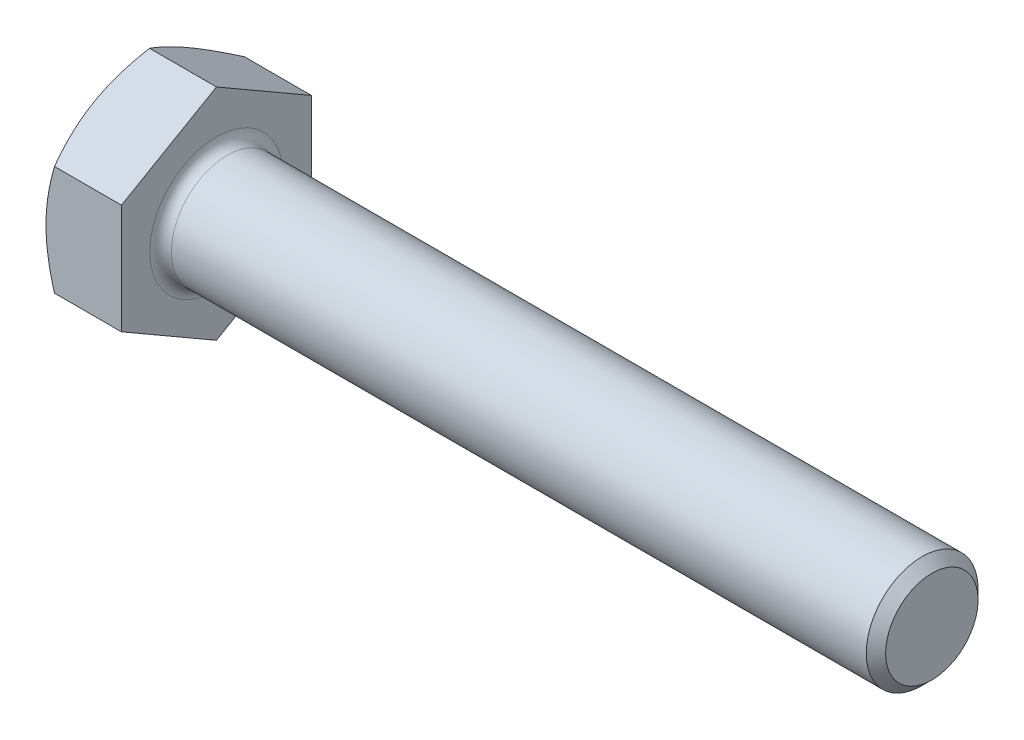
ISO-10303-21;
HEADER;
FILE_DESCRIPTION(('STEP AP214'),'2;1');
FILE_NAME('part.step','',(''),(''),'','','');
FILE_SCHEMA(('AUTOMOTIVE_DESIGN { 1 0 10303 214 1 1 1 1 }'));
ENDSEC;
DATA;
#1=APPLICATION_CONTEXT('core data for automotive mechanical design processes');
#2=APPLICATION_PROTOCOL_DEFINITION('international standard','automotive_design',2000,#1);
#3=PRODUCT_CONTEXT('',#1,'mechanical');
#4=PRODUCT('Part','Part','',(#3));
#5=PRODUCT_RELATED_PRODUCT_CATEGORY('part','',(#4));
#6=PRODUCT_DEFINITION_FORMATION('','',#4);
#7=PRODUCT_DEFINITION_CONTEXT('part definition',#1,'design');
#8=PRODUCT_DEFINITION('design','',#6,#7);
#9=PRODUCT_DEFINITION_SHAPE('','',#8);
#10=(LENGTH_UNIT() NAMED_UNIT(*) SI_UNIT(.MILLI.,.METRE.));
#11=(NAMED_UNIT(*) PLANE_ANGLE_UNIT() SI_UNIT($,.RADIAN.));
#12=(NAMED_UNIT(*) SI_UNIT($,.STERADIAN.) SOLID_ANGLE_UNIT());
#13=UNCERTAINTY_MEASURE_WITH_UNIT(LENGTH_MEASURE(1.E-05),#10,'distance_accuracy_value','');
#14=(GEOMETRIC_REPRESENTATION_CONTEXT(3) GLOBAL_UNCERTAINTY_ASSIGNED_CONTEXT((#13)) GLOBAL_UNIT_ASSIGNED_CONTEXT((#10,
#11,#12)) REPRESENTATION_CONTEXT('',''));
#15=CARTESIAN_POINT('',(0.,0.,0.));
#16=DIRECTION('',(0.,0.,1.));
#17=DIRECTION('',(1.,0.,0.));
#18=AXIS2_PLACEMENT_3D('',#15,#16,#17);
#19=CARTESIAN_POINT('',(-58.0005303203912,-2.0366752609924E-05,3.15651972024237E-06));
#20=DIRECTION('',(1.,0.,0.));
#21=DIRECTION('',(0.,1.,0.));
#22=AXIS2_PLACEMENT_3D('',#19,#20,#21);
#23=PLANE('',#22);
#24=CARTESIAN_POINT('',(-58.000530320382,-2.0366752595966E-05,3.1565197169117E-06));
#25=DIRECTION('',(1.,0.,0.));
#26=DIRECTION('',(0.,1.,0.));
#27=AXIS2_PLACEMENT_3D('',#24,#25,#26);
#28=CIRCLE('',#27,26.9874999999947);
#29=CARTESIAN_POINT('',(-58.0005303203805,-23.3718809513828,-13.4937468434789));
#30=VERTEX_POINT('',#29);
#31=CARTESIAN_POINT('',(-58.0005303203805,-2.03667525978211E-05,-26.9874968434776));
#32=VERTEX_POINT('',#31);
#33=EDGE_CURVE('E496',#30,#32,#28,.T.);
#34=ORIENTED_EDGE('',*,*,#33,.F.);
#35=CARTESIAN_POINT('',(-58.000530320382,-2.03667525958311E-05,3.15651971704658E-06));
#36=DIRECTION('',(1.,0.,0.));
#37=DIRECTION('',(0.,1.,0.));
#38=AXIS2_PLACEMENT_3D('',#35,#36,#37);
#39=CIRCLE('',#38,26.9874999999947);
#40=CARTESIAN_POINT('',(-58.0005303203805,-23.3718809513828,13.4937531565184));
#41=VERTEX_POINT('',#40);
#42=EDGE_CURVE('E107',#41,#30,#39,.T.);
#43=ORIENTED_EDGE('',*,*,#42,.F.);
#44=CARTESIAN_POINT('',(-58.000530320382,-2.03667525961008E-05,3.1565197169117E-06));
#45=DIRECTION('',(1.,0.,0.));
#46=DIRECTION('',(0.,1.,0.));
#47=AXIS2_PLACEMENT_3D('',#44,#45,#46);
#48=CIRCLE('',#47,26.9874999999947);
#49=CARTESIAN_POINT('',(-58.0005303203805,-2.03667526123641E-05,26.9875031565171));
#50=VERTEX_POINT('',#49);
#51=EDGE_CURVE('E104',#50,#41,#48,.T.);
#52=ORIENTED_EDGE('',*,*,#51,.F.);
#53=CARTESIAN_POINT('',(-58.000530320382,-2.03667525958311E-05,3.15651971704658E-06));
#54=DIRECTION('',(1.,0.,0.));
#55=DIRECTION('',(0.,1.,0.));
#56=AXIS2_PLACEMENT_3D('',#53,#54,#55);
#57=CIRCLE('',#56,26.9874999999947);
#58=CARTESIAN_POINT('',(-58.0005303203805,23.3718402178776,13.4937531565184));
#59=VERTEX_POINT('',#58);
#60=EDGE_CURVE('E37',#59,#50,#57,.T.);
#61=ORIENTED_EDGE('',*,*,#60,.F.);
#62=CARTESIAN_POINT('',(-58.000530320382,-2.03667525958311E-05,3.15651971704658E-06));
#63=DIRECTION('',(1.,0.,0.));
#64=DIRECTION('',(0.,1.,0.));
#65=AXIS2_PLACEMENT_3D('',#62,#63,#64);
#66=CIRCLE('',#65,26.9874999999947);
#67=CARTESIAN_POINT('',(-58.0005303203805,23.3718402178776,-13.493746843479));
#68=VERTEX_POINT('',#67);
#69=EDGE_CURVE('E490',#68,#59,#66,.T.);
#70=ORIENTED_EDGE('',*,*,#69,.F.);
#71=CARTESIAN_POINT('',(-58.000530320382,-2.0366752595966E-05,3.1565197169117E-06));
#72=DIRECTION('',(1.,0.,0.));
#73=DIRECTION('',(0.,1.,0.));
#74=AXIS2_PLACEMENT_3D('',#71,#72,#73);
#75=CIRCLE('',#74,26.9874999999947);
#76=EDGE_CURVE('E164',#32,#68,#75,.T.);
#77=ORIENTED_EDGE('',*,*,#76,.F.);
#78=EDGE_LOOP('',(#34,#43,#52,#61,#70,#77));
#79=FACE_BOUND('',#78,.T.);
#80=ADVANCED_FACE('F34',(#79),#23,.F.);
#81=CARTESIAN_POINT('',(-55.5756414858232,-2.0366752597045E-05,3.1565197169117E-06));
#82=DIRECTION('',(1.,0.,0.));
#83=DIRECTION('',(0.,1.,0.));
#84=AXIS2_PLACEMENT_3D('',#81,#82,#83);
#85=CONICAL_SURFACE('',#84,31.18753066419,1.0471975512);
#86=CARTESIAN_POINT('',(-58.000530320379,23.3718402178799,13.4937531565197));
#87=CARTESIAN_POINT('',(-58.0005353544012,23.2065060676351,13.78012030497));
#88=CARTESIAN_POINT('',(-57.9970208255,23.0411770613658,14.0664785437932));
#89=CARTESIAN_POINT('',(-57.9829985085223,22.7105956023868,14.639062426785));
#90=CARTESIAN_POINT('',(-57.9724908249409,22.5453431485701,14.9252880728711));
#91=CARTESIAN_POINT('',(-57.9305535718455,22.049874004314,15.7834658043053));
#92=CARTESIAN_POINT('',(-57.8887097564634,21.719863989697,16.3550599166285));
#93=CARTESIAN_POINT('',(-57.778458963356,21.0626340584388,17.4934155498227));
#94=CARTESIAN_POINT('',(-57.7101857121321,20.735408439007,18.0601869482168));
#95=CARTESIAN_POINT('',(-57.548501473975,20.0825115789614,19.1910374819179));
#96=CARTESIAN_POINT('',(-57.45508982538,19.7568403794909,19.7551165459628));
#97=CARTESIAN_POINT('',(-57.2450448504076,19.1077901818838,20.8793044648809));
#98=CARTESIAN_POINT('',(-57.1284396339963,18.7844088950283,21.4394172839317));
#99=CARTESIAN_POINT('',(-56.8739123923822,18.1397397155662,22.5560170568337));
#100=CARTESIAN_POINT('',(-56.7359890681096,17.8184519517777,23.1125037875656));
#101=CARTESIAN_POINT('',(-56.4401322343829,17.1764672246191,24.2244539526875));
#102=CARTESIAN_POINT('',(-56.2820997861566,16.8557817298499,24.7798975228781));
#103=CARTESIAN_POINT('',(-55.9486440256743,16.2167573723269,25.886720177382));
#104=CARTESIAN_POINT('',(-55.7732249250192,15.8984179612521,26.438100211415));
#105=CARTESIAN_POINT('',(-55.5901040434858,15.5812200230015,26.9875031565213));
#106=B_SPLINE_CURVE_WITH_KNOTS('',3,(#86,#87,#88,#89,#90,#91,#92,#93,#94,#95,#96,#97,#98,#99,
#100,#101,#102,#103,#104,#105),.UNSPECIFIED.,.F.,.F.,(4,2,2,2,2,2,2,2,2,4),(0.,
0.991966034236332,1.98391724638906,3.96733081877745,5.940837277035,7.91439568456661,
9.88557661005472,11.8568777015482,13.8382826880148,15.8192088826776),.UNSPECIFIED.);
#107=CARTESIAN_POINT('',(-55.5901040434858,15.5812200230028,26.9875031565205));
#108=VERTEX_POINT('',#107);
#109=EDGE_CURVE('E126',#59,#108,#106,.T.);
#110=ORIENTED_EDGE('',*,*,#109,.F.);
#111=ORIENTED_EDGE('',*,*,#60,.T.);
#112=CARTESIAN_POINT('',(-55.5901040434858,15.5812200230042,26.9875031565197));
#113=CARTESIAN_POINT('',(-55.7732249250192,14.9468241465028,26.9875031565197));
#114=CARTESIAN_POINT('',(-55.9486440256743,14.3101453243533,26.9875031565197));
#115=CARTESIAN_POINT('',(-56.2820997861566,13.0320966093074,26.9875031565197));
#116=CARTESIAN_POINT('',(-56.4401322343829,12.390725619769,26.9875031565197));
#117=CARTESIAN_POINT('',(-56.7359890681096,11.1067561654518,26.9875031565197));
#118=CARTESIAN_POINT('',(-56.8739123923822,10.4641806378748,26.9875031565197));
#119=CARTESIAN_POINT('',(-57.1284396339963,9.17484227895065,26.9875031565197));
#120=CARTESIAN_POINT('',(-57.2450448504076,8.52807970523963,26.9875031565197));
#121=CARTESIAN_POINT('',(-57.45508982538,7.22997931002544,26.9875031565197));
#122=CARTESIAN_POINT('',(-57.548501473975,6.57863691108439,26.9875031565197));
#123=CARTESIAN_POINT('',(-57.7101857121321,5.27284319099328,26.9875031565197));
#124=CARTESIAN_POINT('',(-57.778458963356,4.61839195212956,26.9875031565197));
#125=CARTESIAN_POINT('',(-57.8887097564634,3.30393208961317,26.9875031565197));
#126=CARTESIAN_POINT('',(-57.9305535718455,2.64391206037921,26.9875031565197));
#127=CARTESIAN_POINT('',(-57.9724908249409,1.652973771867,26.9875031565197));
#128=CARTESIAN_POINT('',(-57.9829985085223,1.32246886423351,26.9875031565197));
#129=CARTESIAN_POINT('',(-57.9970208255,0.661305946275521,26.9875031565197));
#130=CARTESIAN_POINT('',(-58.0005353544012,0.330647933737092,26.9875031565197));
#131=CARTESIAN_POINT('',(-58.000530320379,-2.03667526142769E-05,26.9875031565197));
#132=B_SPLINE_CURVE_WITH_KNOTS('',3,(#112,#113,#114,#115,#116,#117,#118,#119,#120,#121,#122,
#123,#124,#125,#126,#127,#128,#129,#130,#131),.UNSPECIFIED.,.F.,.F.,(4,2,2,2,2,2,2,2,2,4),(0.,
1.98092619466272,3.9623311811293,5.93363227262283,7.90481319811093,9.87837160564253,
11.8518780639001,13.8352916362885,14.8272428484412,15.8192088826775),.UNSPECIFIED.);
#133=EDGE_CURVE('E124',#108,#50,#132,.T.);
#134=ORIENTED_EDGE('',*,*,#133,.F.);
#135=EDGE_LOOP('',(#110,#111,#134));
#136=FACE_BOUND('',#135,.T.);
#137=ADVANCED_FACE('F123',(#136),#85,.T.);
#138=CARTESIAN_POINT('',(-55.5756414858232,-2.0366752597045E-05,3.1565197169117E-06));
#139=DIRECTION('',(1.,0.,0.));
#140=DIRECTION('',(0.,1.,0.));
#141=AXIS2_PLACEMENT_3D('',#138,#139,#140);
#142=CONICAL_SURFACE('',#141,31.18753066419,1.0471975512);
#143=CARTESIAN_POINT('',(-58.000530320379,-2.03667526123025E-05,26.9875031565197));
#144=CARTESIAN_POINT('',(-58.0005353544012,-0.33068866724232,26.9875031565197));
#145=CARTESIAN_POINT('',(-57.9970208255,-0.66134667978075,26.9875031565197));
#146=CARTESIAN_POINT('',(-57.9829985085223,-1.32250959773875,26.9875031565197));
#147=CARTESIAN_POINT('',(-57.9724908249409,-1.65301450537223,26.9875031565197));
#148=CARTESIAN_POINT('',(-57.9305535718455,-2.64395279388444,26.9875031565197));
#149=CARTESIAN_POINT('',(-57.8887097564634,-3.3039728231184,26.9875031565197));
#150=CARTESIAN_POINT('',(-57.778458963356,-4.6184326856348,26.9875031565197));
#151=CARTESIAN_POINT('',(-57.7101857121321,-5.27288392449851,26.9875031565197));
#152=CARTESIAN_POINT('',(-57.548501473975,-6.57867764458963,26.9875031565197));
#153=CARTESIAN_POINT('',(-57.45508982538,-7.23002004353068,26.9875031565197));
#154=CARTESIAN_POINT('',(-57.2450448504076,-8.52812043874487,26.9875031565197));
#155=CARTESIAN_POINT('',(-57.1284396339963,-9.1748830124559,26.9875031565197));
#156=CARTESIAN_POINT('',(-56.8739123923822,-10.4642213713801,26.9875031565197));
#157=CARTESIAN_POINT('',(-56.7359890681096,-11.1067968989571,26.9875031565197));
#158=CARTESIAN_POINT('',(-56.4401322343829,-12.3907663532742,26.9875031565197));
#159=CARTESIAN_POINT('',(-56.2820997861566,-13.0321373428127,26.9875031565197));
#160=CARTESIAN_POINT('',(-55.9486440256743,-14.3101860578586,26.9875031565197));
#161=CARTESIAN_POINT('',(-55.7732249250192,-14.9468648800081,26.9875031565197));
#162=CARTESIAN_POINT('',(-55.5901040434858,-15.5812607565094,26.9875031565197));
#163=B_SPLINE_CURVE_WITH_KNOTS('',3,(#143,#144,#145,#146,#147,#148,#149,#150,#151,#152,#153,
#154,#155,#156,#157,#158,#159,#160,#161,#162),.UNSPECIFIED.,.F.,.F.,(4,2,2,2,2,2,2,2,2,4),(0.,
0.991966034236332,1.98391724638906,3.96733081877745,5.94083727703499,7.9143956845666,
9.88557661005471,11.8568777015482,13.8382826880148,15.8192088826775),.UNSPECIFIED.);
#164=CARTESIAN_POINT('',(-55.5901040434858,-15.5812607565081,26.9875031565205));
#165=VERTEX_POINT('',#164);
#166=EDGE_CURVE('E111',#50,#165,#163,.T.);
#167=ORIENTED_EDGE('',*,*,#166,.F.);
#168=ORIENTED_EDGE('',*,*,#51,.T.);
#169=CARTESIAN_POINT('',(-55.5901040434858,-15.5812607565068,26.9875031565212));
#170=CARTESIAN_POINT('',(-55.7732249250192,-15.8984586947574,26.438100211415));
#171=CARTESIAN_POINT('',(-55.9486440256743,-16.2167981058322,25.886720177382));
#172=CARTESIAN_POINT('',(-56.2820997861566,-16.8558224633552,24.7798975228781));
#173=CARTESIAN_POINT('',(-56.4401322343829,-17.1765079581244,24.2244539526875));
#174=CARTESIAN_POINT('',(-56.7359890681096,-17.818492685283,23.1125037875656));
#175=CARTESIAN_POINT('',(-56.8739123923822,-18.1397804490714,22.5560170568337));
#176=CARTESIAN_POINT('',(-57.1284396339963,-18.7844496285335,21.4394172839317));
#177=CARTESIAN_POINT('',(-57.2450448504076,-19.107830915389,20.8793044648809));
#178=CARTESIAN_POINT('',(-57.45508982538,-19.7568811129961,19.7551165459628));
#179=CARTESIAN_POINT('',(-57.548501473975,-20.0825523124667,19.1910374819179));
#180=CARTESIAN_POINT('',(-57.7101857121321,-20.7354491725122,18.0601869482169));
#181=CARTESIAN_POINT('',(-57.778458963356,-21.0626747919441,17.4934155498227));
#182=CARTESIAN_POINT('',(-57.8887097564634,-21.7199047232023,16.3550599166285));
#183=CARTESIAN_POINT('',(-57.9305535718455,-22.0499147378192,15.7834658043053));
#184=CARTESIAN_POINT('',(-57.9724908249408,-22.5453838820754,14.9252880728711));
#185=CARTESIAN_POINT('',(-57.9829985085223,-22.7106363358921,14.6390624267851));
#186=CARTESIAN_POINT('',(-57.9970208255,-23.0412177948711,14.0664785437932));
#187=CARTESIAN_POINT('',(-58.0005353544012,-23.2065468011403,13.78012030497));
#188=CARTESIAN_POINT('',(-58.0005303203789,-23.3718809513852,13.4937531565197));
#189=B_SPLINE_CURVE_WITH_KNOTS('',3,(#169,#170,#171,#172,#173,#174,#175,#176,#177,#178,#179,
#180,#181,#182,#183,#184,#185,#186,#187,#188),.UNSPECIFIED.,.F.,.F.,(4,2,2,2,2,2,2,2,2,4),(0.,
1.98092619466272,3.96233118112929,5.93363227262282,7.90481319811093,9.87837160564253,
11.8518780639001,13.8352916362885,14.8272428484412,15.8192088826775),.UNSPECIFIED.);
#190=EDGE_CURVE('E114',#165,#41,#189,.T.);
#191=ORIENTED_EDGE('',*,*,#190,.F.);
#192=EDGE_LOOP('',(#167,#168,#191));
#193=FACE_BOUND('',#192,.T.);
#194=ADVANCED_FACE('F112',(#193),#142,.T.);
#195=CARTESIAN_POINT('',(-55.5756414858232,-2.0366752597045E-05,3.1565197169117E-06));
#196=DIRECTION('',(1.,0.,0.));
#197=DIRECTION('',(0.,1.,0.));
#198=AXIS2_PLACEMENT_3D('',#195,#196,#197);
#199=CONICAL_SURFACE('',#198,31.18753066419,1.0471975512);
#200=ORIENTED_EDGE('',*,*,#42,.T.);
#201=CARTESIAN_POINT('',(-55.5901040434858,-31.1625011462635,3.15652124540661E-06));
#202=CARTESIAN_POINT('',(-55.7732249250192,-30.8453032080129,-0.549399788584996));
#203=CARTESIAN_POINT('',(-55.9486440256743,-30.5269637969381,-1.10077982261803));
#204=CARTESIAN_POINT('',(-56.2820997861566,-29.8879394394152,-2.20760247712186));
#205=CARTESIAN_POINT('',(-56.4401322343829,-29.5672539446459,-2.76304604731252));
#206=CARTESIAN_POINT('',(-56.7359890681096,-28.9252692174874,-3.87499621243441));
#207=CARTESIAN_POINT('',(-56.8739123923822,-28.6039814536989,-4.43148294316626));
#208=CARTESIAN_POINT('',(-57.1284396339963,-27.9593122742368,-5.54808271606834));
#209=CARTESIAN_POINT('',(-57.2450448504076,-27.6359309873813,-6.10819553511909));
#210=CARTESIAN_POINT('',(-57.45508982538,-26.9868807897742,-7.23238345403719));
#211=CARTESIAN_POINT('',(-57.548501473975,-26.6612095903036,-7.79646251808204));
#212=CARTESIAN_POINT('',(-57.7101857121321,-26.0083127302581,-8.92731305178313));
#213=CARTESIAN_POINT('',(-57.778458963356,-25.6810871108262,-9.4940844501773));
#214=CARTESIAN_POINT('',(-57.8887097564634,-25.023857179568,-10.6324400833715));
#215=CARTESIAN_POINT('',(-57.9305535718455,-24.693847164951,-11.2040341956947));
#216=CARTESIAN_POINT('',(-57.9724908249409,-24.1983780206949,-12.0622119271289));
#217=CARTESIAN_POINT('',(-57.9829985085223,-24.0331255668782,-12.3484375732149));
#218=CARTESIAN_POINT('',(-57.9970208255,-23.7025441078992,-12.9210214562068));
#219=CARTESIAN_POINT('',(-58.0005353544012,-23.53721510163,-13.2073796950299));
#220=CARTESIAN_POINT('',(-58.000530320379,-23.3718809513851,-13.4937468434803));
#221=B_SPLINE_CURVE_WITH_KNOTS('',3,(#201,#202,#203,#204,#205,#206,#207,#208,#209,#210,#211,
#212,#213,#214,#215,#216,#217,#218,#219,#220),.UNSPECIFIED.,.F.,.F.,(4,2,2,2,2,2,2,2,2,4),(0.,
1.98092619466272,3.96233118112929,5.93363227262282,7.90481319811093,9.87837160564253,
11.8518780639001,13.8352916362885,14.8272428484412,15.8192088826775),.UNSPECIFIED.);
#222=CARTESIAN_POINT('',(-55.5901040434858,-31.1625011462635,3.15651971411683E-06));
#223=VERTEX_POINT('',#222);
#224=EDGE_CURVE('E254',#223,#30,#221,.T.);
#225=ORIENTED_EDGE('',*,*,#224,.F.);
#226=CARTESIAN_POINT('',(-58.000530320379,-23.3718809513852,13.4937531565197));
#227=CARTESIAN_POINT('',(-58.0005353544012,-23.53721510163,13.2073860080694));
#228=CARTESIAN_POINT('',(-57.9970208255,-23.7025441078992,12.9210277692463));
#229=CARTESIAN_POINT('',(-57.9829985085223,-24.0331255668782,12.3484438862544));
#230=CARTESIAN_POINT('',(-57.9724908249409,-24.198378020695,12.0622182401684));
#231=CARTESIAN_POINT('',(-57.9305535718455,-24.6938471649511,11.2040405087341));
#232=CARTESIAN_POINT('',(-57.8887097564634,-25.023857179568,10.632446396411));
#233=CARTESIAN_POINT('',(-57.778458963356,-25.6810871108262,9.49409076321676));
#234=CARTESIAN_POINT('',(-57.7101857121321,-26.0083127302581,8.92731936482258));
#235=CARTESIAN_POINT('',(-57.548501473975,-26.6612095903037,7.79646883112149));
#236=CARTESIAN_POINT('',(-57.45508982538,-26.9868807897742,7.23238976707664));
#237=CARTESIAN_POINT('',(-57.2450448504076,-27.6359309873813,6.10820184815853));
#238=CARTESIAN_POINT('',(-57.1284396339963,-27.9593122742368,5.54808902910778));
#239=CARTESIAN_POINT('',(-56.8739123923822,-28.6039814536989,4.4314892562057));
#240=CARTESIAN_POINT('',(-56.7359890681096,-28.9252692174874,3.87500252547385));
#241=CARTESIAN_POINT('',(-56.4401322343829,-29.5672539446459,2.76305236035195));
#242=CARTESIAN_POINT('',(-56.2820997861566,-29.8879394394152,2.20760879016129));
#243=CARTESIAN_POINT('',(-55.9486440256743,-30.5269637969381,1.10078613565746));
#244=CARTESIAN_POINT('',(-55.7732249250192,-30.8453032080129,0.54940610162443));
#245=CARTESIAN_POINT('',(-55.5901040434858,-31.1625011462636,3.15651818600029E-06));
#246=B_SPLINE_CURVE_WITH_KNOTS('',3,(#226,#227,#228,#229,#230,#231,#232,#233,#234,#235,#236,
#237,#238,#239,#240,#241,#242,#243,#244,#245),.UNSPECIFIED.,.F.,.F.,(4,2,2,2,2,2,2,2,2,4),(0.,
0.991966034236328,1.98391724638905,3.96733081877744,5.94083727703499,7.91439568456659,
9.8855766100547,11.8568777015482,13.8382826880148,15.8192088826775),.UNSPECIFIED.);
#247=EDGE_CURVE('E131',#41,#223,#246,.T.);
#248=ORIENTED_EDGE('',*,*,#247,.F.);
#249=EDGE_LOOP('',(#200,#225,#248));
#250=FACE_BOUND('',#249,.T.);
#251=ADVANCED_FACE('F243',(#250),#199,.T.);
#252=CARTESIAN_POINT('',(-55.5756414858232,-2.0366752597045E-05,3.1565197169117E-06));
#253=DIRECTION('',(1.,0.,0.));
#254=DIRECTION('',(0.,1.,0.));
#255=AXIS2_PLACEMENT_3D('',#252,#253,#254);
#256=CONICAL_SURFACE('',#255,31.18753066419,1.0471975512);
#257=ORIENTED_EDGE('',*,*,#33,.T.);
#258=CARTESIAN_POINT('',(-55.5901040434858,-15.5812607565094,-26.9874968434803));
#259=CARTESIAN_POINT('',(-55.7732249250192,-14.946864880008,-26.9874968434803));
#260=CARTESIAN_POINT('',(-55.9486440256743,-14.3101860578585,-26.9874968434803));
#261=CARTESIAN_POINT('',(-56.2820997861566,-13.0321373428126,-26.9874968434803));
#262=CARTESIAN_POINT('',(-56.4401322343829,-12.3907663532742,-26.9874968434803));
#263=CARTESIAN_POINT('',(-56.7359890681096,-11.106796898957,-26.9874968434803));
#264=CARTESIAN_POINT('',(-56.8739123923822,-10.46422137138,-26.9874968434803));
#265=CARTESIAN_POINT('',(-57.1284396339963,-9.17488301245586,-26.9874968434803));
#266=CARTESIAN_POINT('',(-57.2450448504076,-8.52812043874483,-26.9874968434803));
#267=CARTESIAN_POINT('',(-57.45508982538,-7.23002004353065,-26.9874968434803));
#268=CARTESIAN_POINT('',(-57.548501473975,-6.5786776445896,-26.9874968434803));
#269=CARTESIAN_POINT('',(-57.7101857121321,-5.27288392449848,-26.9874968434803));
#270=CARTESIAN_POINT('',(-57.778458963356,-4.61843268563477,-26.9874968434803));
#271=CARTESIAN_POINT('',(-57.8887097564634,-3.30397282311838,-26.9874968434803));
#272=CARTESIAN_POINT('',(-57.9305535718455,-2.64395279388442,-26.9874968434803));
#273=CARTESIAN_POINT('',(-57.9724908249409,-1.65301450537221,-26.9874968434803));
#274=CARTESIAN_POINT('',(-57.9829985085223,-1.32250959773872,-26.9874968434803));
#275=CARTESIAN_POINT('',(-57.9970208255,-0.661346679780728,-26.9874968434803));
#276=CARTESIAN_POINT('',(-58.0005353544012,-0.330688667242299,-26.9874968434803));
#277=CARTESIAN_POINT('',(-58.000530320379,-2.03667525923955E-05,-26.9874968434803));
#278=B_SPLINE_CURVE_WITH_KNOTS('',3,(#258,#259,#260,#261,#262,#263,#264,#265,#266,#267,#268,
#269,#270,#271,#272,#273,#274,#275,#276,#277),.UNSPECIFIED.,.F.,.F.,(4,2,2,2,2,2,2,2,2,4),(0.,
1.98092619466272,3.96233118112929,5.93363227262282,7.90481319811093,9.87837160564253,
11.8518780639001,13.8352916362885,14.8272428484412,15.8192088826775),.UNSPECIFIED.);
#279=CARTESIAN_POINT('',(-55.5901040434858,-15.581260756508,-26.987496843481));
#280=VERTEX_POINT('',#279);
#281=EDGE_CURVE('E226',#280,#32,#278,.T.);
#282=ORIENTED_EDGE('',*,*,#281,.F.);
#283=CARTESIAN_POINT('',(-58.000530320379,-23.3718809513851,-13.4937468434803));
#284=CARTESIAN_POINT('',(-58.0005353544012,-23.2065468011403,-13.7801139919306));
#285=CARTESIAN_POINT('',(-57.9970208255,-23.0412177948711,-14.0664722307537));
#286=CARTESIAN_POINT('',(-57.9829985085223,-22.7106363358921,-14.6390561137456));
#287=CARTESIAN_POINT('',(-57.9724908249409,-22.5453838820753,-14.9252817598316));
#288=CARTESIAN_POINT('',(-57.9305535718455,-22.0499147378192,-15.7834594912659));
#289=CARTESIAN_POINT('',(-57.8887097564634,-21.7199047232022,-16.355053603589));
#290=CARTESIAN_POINT('',(-57.778458963356,-21.062674791944,-17.4934092367832));
#291=CARTESIAN_POINT('',(-57.7101857121322,-20.7354491725122,-18.0601806351774));
#292=CARTESIAN_POINT('',(-57.548501473975,-20.0825523124666,-19.1910311688785));
#293=CARTESIAN_POINT('',(-57.45508982538,-19.7568811129961,-19.7551102329234));
#294=CARTESIAN_POINT('',(-57.2450448504076,-19.107830915389,-20.8792981518415));
#295=CARTESIAN_POINT('',(-57.1284396339963,-18.7844496285335,-21.4394109708922));
#296=CARTESIAN_POINT('',(-56.8739123923822,-18.1397804490714,-22.5560107437943));
#297=CARTESIAN_POINT('',(-56.7359890681096,-17.8184926852829,-23.1124974745262));
#298=CARTESIAN_POINT('',(-56.4401322343829,-17.1765079581243,-24.224447639648));
#299=CARTESIAN_POINT('',(-56.2820997861566,-16.8558224633551,-24.7798912098387));
#300=CARTESIAN_POINT('',(-55.9486440256743,-16.2167981058321,-25.8867138643425));
#301=CARTESIAN_POINT('',(-55.7732249250192,-15.8984586947574,-26.4380938983756));
#302=CARTESIAN_POINT('',(-55.5901040434858,-15.5812607565067,-26.9874968434818));
#303=B_SPLINE_CURVE_WITH_KNOTS('',3,(#283,#284,#285,#286,#287,#288,#289,#290,#291,#292,#293,
#294,#295,#296,#297,#298,#299,#300,#301,#302),.UNSPECIFIED.,.F.,.F.,(4,2,2,2,2,2,2,2,2,4),(0.,
0.99196603423633,1.98391724638906,3.96733081877745,5.940837277035,7.9143956845666,
9.88557661005471,11.8568777015482,13.8382826880148,15.8192088826775),.UNSPECIFIED.);
#304=EDGE_CURVE('E234',#30,#280,#303,.T.);
#305=ORIENTED_EDGE('',*,*,#304,.F.);
#306=EDGE_LOOP('',(#257,#282,#305));
#307=FACE_BOUND('',#306,.T.);
#308=ADVANCED_FACE('F240',(#307),#256,.T.);
#309=CARTESIAN_POINT('',(-55.5756414858232,-2.0366752597045E-05,3.1565197169117E-06));
#310=DIRECTION('',(1.,0.,0.));
#311=DIRECTION('',(0.,1.,0.));
#312=AXIS2_PLACEMENT_3D('',#309,#310,#311);
#313=CONICAL_SURFACE('',#312,31.18753066419,1.0471975512);
#314=CARTESIAN_POINT('',(-58.0005303203789,23.3718402178799,-13.4937468434803));
#315=CARTESIAN_POINT('',(-58.0005353544012,23.5371743681248,-13.20737969503));
#316=CARTESIAN_POINT('',(-57.9970208255,23.702503374394,-12.9210214562068));
#317=CARTESIAN_POINT('',(-57.9829985085223,24.033084833373,-12.348437573215));
#318=CARTESIAN_POINT('',(-57.9724908249408,24.1983372871897,-12.0622119271289));
#319=CARTESIAN_POINT('',(-57.9305535718455,24.6938064314459,-11.2040341956947));
#320=CARTESIAN_POINT('',(-57.8887097564634,25.0238164460628,-10.6324400833715));
#321=CARTESIAN_POINT('',(-57.778458963356,25.681046377321,-9.49408445017732));
#322=CARTESIAN_POINT('',(-57.7101857121321,26.0082719967529,-8.92731305178314));
#323=CARTESIAN_POINT('',(-57.548501473975,26.6611688567984,-7.79646251808205));
#324=CARTESIAN_POINT('',(-57.45508982538,26.986840056269,-7.2323834540372));
#325=CARTESIAN_POINT('',(-57.2450448504076,27.6358902538761,-6.10819553511909));
#326=CARTESIAN_POINT('',(-57.1284396339963,27.9592715407316,-5.54808271606834));
#327=CARTESIAN_POINT('',(-56.8739123923822,28.6039407201937,-4.43148294316626));
#328=CARTESIAN_POINT('',(-56.7359890681096,28.9252284839822,-3.87499621243441));
#329=CARTESIAN_POINT('',(-56.4401322343829,29.5672132111407,-2.76304604731251));
#330=CARTESIAN_POINT('',(-56.2820997861566,29.88789870591,-2.20760247712185));
#331=CARTESIAN_POINT('',(-55.9486440256743,30.5269230634329,-1.10077982261801));
#332=CARTESIAN_POINT('',(-55.7732249250192,30.8452624745077,-0.549399788584981));
#333=CARTESIAN_POINT('',(-55.5901040434857,31.1624604127583,3.15652126326831E-06));
#334=B_SPLINE_CURVE_WITH_KNOTS('',3,(#314,#315,#316,#317,#318,#319,#320,#321,#322,#323,#324,
#325,#326,#327,#328,#329,#330,#331,#332,#333),.UNSPECIFIED.,.F.,.F.,(4,2,2,2,2,2,2,2,2,4),(0.,
0.991966034236332,1.98391724638906,3.96733081877745,5.94083727703499,7.9143956845666,
9.88557661005471,11.8568777015482,13.8382826880148,15.8192088826776),.UNSPECIFIED.);
#335=CARTESIAN_POINT('',(-55.590104043486,31.1624604127579,3.1565189505843E-06));
#336=VERTEX_POINT('',#335);
#337=EDGE_CURVE('E206',#68,#336,#334,.T.);
#338=ORIENTED_EDGE('',*,*,#337,.F.);
#339=ORIENTED_EDGE('',*,*,#69,.T.);
#340=CARTESIAN_POINT('',(-55.5901040434857,31.1624604127583,3.15651817561145E-06));
#341=CARTESIAN_POINT('',(-55.7732249250192,30.8452624745077,0.54940610162442));
#342=CARTESIAN_POINT('',(-55.9486440256743,30.5269230634329,1.10078613565745));
#343=CARTESIAN_POINT('',(-56.2820997861566,29.8878987059099,2.20760879016128));
#344=CARTESIAN_POINT('',(-56.4401322343829,29.5672132111407,2.76305236035194));
#345=CARTESIAN_POINT('',(-56.7359890681096,28.9252284839821,3.87500252547384));
#346=CARTESIAN_POINT('',(-56.8739123923822,28.6039407201936,4.43148925620569));
#347=CARTESIAN_POINT('',(-57.1284396339963,27.9592715407316,5.54808902910777));
#348=CARTESIAN_POINT('',(-57.2450448504076,27.635890253876,6.10820184815852));
#349=CARTESIAN_POINT('',(-57.45508982538,26.9868400562689,7.23238976707662));
#350=CARTESIAN_POINT('',(-57.548501473975,26.6611688567984,7.79646883112147));
#351=CARTESIAN_POINT('',(-57.7101857121321,26.0082719967529,8.92731936482256));
#352=CARTESIAN_POINT('',(-57.778458963356,25.681046377321,9.49409076321674));
#353=CARTESIAN_POINT('',(-57.8887097564634,25.0238164460628,10.6324463964109));
#354=CARTESIAN_POINT('',(-57.9305535718455,24.6938064314458,11.2040405087341));
#355=CARTESIAN_POINT('',(-57.9724908249409,24.1983372871897,12.0622182401683));
#356=CARTESIAN_POINT('',(-57.9829985085223,24.033084833373,12.3484438862544));
#357=CARTESIAN_POINT('',(-57.9970208255,23.702503374394,12.9210277692462));
#358=CARTESIAN_POINT('',(-58.0005353544012,23.5371743681248,13.2073860080694));
#359=CARTESIAN_POINT('',(-58.000530320379,23.3718402178799,13.4937531565197));
#360=B_SPLINE_CURVE_WITH_KNOTS('',3,(#340,#341,#342,#343,#344,#345,#346,#347,#348,#349,#350,
#351,#352,#353,#354,#355,#356,#357,#358,#359),.UNSPECIFIED.,.F.,.F.,(4,2,2,2,2,2,2,2,2,4),(0.,
1.98092619466272,3.9623311811293,5.93363227262283,7.90481319811094,9.87837160564254,
11.8518780639001,13.8352916362885,14.8272428484412,15.8192088826775),.UNSPECIFIED.);
#361=EDGE_CURVE('E119',#336,#59,#360,.T.);
#362=ORIENTED_EDGE('',*,*,#361,.F.);
#363=EDGE_LOOP('',(#338,#339,#362));
#364=FACE_BOUND('',#363,.T.);
#365=ADVANCED_FACE('F180',(#364),#313,.T.);
#366=CARTESIAN_POINT('',(-55.5756414858232,-2.0366752597045E-05,3.1565197169117E-06));
#367=DIRECTION('',(1.,0.,0.));
#368=DIRECTION('',(0.,1.,0.));
#369=AXIS2_PLACEMENT_3D('',#366,#367,#368);
#370=CONICAL_SURFACE('',#369,31.1875306641901,1.0471975512);
#371=ORIENTED_EDGE('',*,*,#76,.T.);
#372=CARTESIAN_POINT('',(-55.5901040434857,15.5812200230015,-26.9874968434818));
#373=CARTESIAN_POINT('',(-55.7732249250192,15.8984179612522,-26.4380938983756));
#374=CARTESIAN_POINT('',(-55.9486440256743,16.216757372327,-25.8867138643425));
#375=CARTESIAN_POINT('',(-56.2820997861566,16.8557817298499,-24.7798912098387));
#376=CARTESIAN_POINT('',(-56.4401322343829,17.1764672246191,-24.2244476396481));
#377=CARTESIAN_POINT('',(-56.7359890681096,17.8184519517777,-23.1124974745262));
#378=CARTESIAN_POINT('',(-56.8739123923822,18.1397397155662,-22.5560107437943));
#379=CARTESIAN_POINT('',(-57.1284396339963,18.7844088950283,-21.4394109708922));
#380=CARTESIAN_POINT('',(-57.2450448504076,19.1077901818838,-20.8792981518415));
#381=CARTESIAN_POINT('',(-57.45508982538,19.7568403794909,-19.7551102329234));
#382=CARTESIAN_POINT('',(-57.548501473975,20.0825115789614,-19.1910311688785));
#383=CARTESIAN_POINT('',(-57.7101857121321,20.735408439007,-18.0601806351774));
#384=CARTESIAN_POINT('',(-57.778458963356,21.0626340584388,-17.4934092367833));
#385=CARTESIAN_POINT('',(-57.8887097564634,21.719863989697,-16.3550536035891));
#386=CARTESIAN_POINT('',(-57.9305535718455,22.049874004314,-15.7834594912659));
#387=CARTESIAN_POINT('',(-57.9724908249408,22.5453431485701,-14.9252817598317));
#388=CARTESIAN_POINT('',(-57.9829985085223,22.7105956023869,-14.6390561137456));
#389=CARTESIAN_POINT('',(-57.9970208255,23.0411770613659,-14.0664722307538));
#390=CARTESIAN_POINT('',(-58.0005353544012,23.2065060676351,-13.7801139919306));
#391=CARTESIAN_POINT('',(-58.0005303203789,23.3718402178799,-13.4937468434803));
#392=B_SPLINE_CURVE_WITH_KNOTS('',3,(#372,#373,#374,#375,#376,#377,#378,#379,#380,#381,#382,
#383,#384,#385,#386,#387,#388,#389,#390,#391),.UNSPECIFIED.,.F.,.F.,(4,2,2,2,2,2,2,2,2,4),(0.,
1.98092619466272,3.96233118112929,5.93363227262283,7.90481319811093,9.87837160564253,
11.8518780639001,13.8352916362885,14.8272428484412,15.8192088826775),.UNSPECIFIED.);
#393=CARTESIAN_POINT('',(-55.5901040434857,15.5812200230029,-26.987496843481));
#394=VERTEX_POINT('',#393);
#395=EDGE_CURVE('E195',#394,#68,#392,.T.);
#396=ORIENTED_EDGE('',*,*,#395,.F.);
#397=CARTESIAN_POINT('',(-58.000530320379,-2.03667525947187E-05,-26.9874968434803));
#398=CARTESIAN_POINT('',(-58.0005353544012,0.330647933737113,-26.9874968434803));
#399=CARTESIAN_POINT('',(-57.9970208255,0.661305946275543,-26.9874968434803));
#400=CARTESIAN_POINT('',(-57.9829985085223,1.32246886423354,-26.9874968434803));
#401=CARTESIAN_POINT('',(-57.9724908249408,1.65297377186702,-26.9874968434803));
#402=CARTESIAN_POINT('',(-57.9305535718455,2.64391206037924,-26.9874968434803));
#403=CARTESIAN_POINT('',(-57.8887097564634,3.3039320896132,-26.9874968434803));
#404=CARTESIAN_POINT('',(-57.778458963356,4.61839195212959,-26.9874968434803));
#405=CARTESIAN_POINT('',(-57.7101857121321,5.27284319099331,-26.9874968434803));
#406=CARTESIAN_POINT('',(-57.548501473975,6.57863691108443,-26.9874968434803));
#407=CARTESIAN_POINT('',(-57.45508982538,7.22997931002547,-26.9874968434803));
#408=CARTESIAN_POINT('',(-57.2450448504076,8.52807970523966,-26.9874968434803));
#409=CARTESIAN_POINT('',(-57.1284396339963,9.17484227895069,-26.9874968434803));
#410=CARTESIAN_POINT('',(-56.8739123923822,10.4641806378749,-26.9874968434803));
#411=CARTESIAN_POINT('',(-56.7359890681096,11.1067561654518,-26.9874968434803));
#412=CARTESIAN_POINT('',(-56.4401322343829,12.390725619769,-26.9874968434803));
#413=CARTESIAN_POINT('',(-56.2820997861566,13.0320966093074,-26.9874968434803));
#414=CARTESIAN_POINT('',(-55.9486440256743,14.3101453243534,-26.9874968434803));
#415=CARTESIAN_POINT('',(-55.7732249250192,14.9468241465029,-26.9874968434803));
#416=CARTESIAN_POINT('',(-55.5901040434857,15.5812200230042,-26.9874968434803));
#417=B_SPLINE_CURVE_WITH_KNOTS('',3,(#397,#398,#399,#400,#401,#402,#403,#404,#405,#406,#407,
#408,#409,#410,#411,#412,#413,#414,#415,#416),.UNSPECIFIED.,.F.,.F.,(4,2,2,2,2,2,2,2,2,4),(0.,
0.991966034236331,1.98391724638906,3.96733081877745,5.94083727703499,7.9143956845666,
9.8855766100547,11.8568777015482,13.8382826880148,15.8192088826775),.UNSPECIFIED.);
#418=EDGE_CURVE('E186',#32,#394,#417,.T.);
#419=ORIENTED_EDGE('',*,*,#418,.F.);
#420=EDGE_LOOP('',(#371,#396,#419));
#421=FACE_BOUND('',#420,.T.);
#422=ADVANCED_FACE('F175',(#421),#370,.T.);
#423=CARTESIAN_POINT('',(-36.5692803203912,31.1624604127574,3.15651973994883E-06));
#424=DIRECTION('',(0.,0.866025403784438,0.500000000000001));
#425=DIRECTION('',(0.,-0.500000000000001,0.866025403784438));
#426=AXIS2_PLACEMENT_3D('',#423,#424,#425);
#427=PLANE('',#426);
#428=DIRECTION('',(1.,0.,0.));
#429=VECTOR('',#428,1.);
#430=CARTESIAN_POINT('',(-36.5692803203912,31.1624604127575,3.1565197238506E-06));
#431=LINE('',#430,#429);
#432=CARTESIAN_POINT('',(-36.5692803203912,31.1624604127574,3.1565197351263E-06));
#433=VERTEX_POINT('',#432);
#434=EDGE_CURVE('E311',#336,#433,#431,.T.);
#435=ORIENTED_EDGE('',*,*,#434,.F.);
#436=ORIENTED_EDGE('',*,*,#361,.T.);
#437=ORIENTED_EDGE('',*,*,#109,.T.);
#438=DIRECTION('',(1.,0.,0.));
#439=VECTOR('',#438,1.);
#440=CARTESIAN_POINT('',(-36.5692803203912,15.5812200230024,26.9875031565197));
#441=LINE('',#440,#439);
#442=CARTESIAN_POINT('',(-36.5692803203912,15.5812200230024,26.9875031565197));
#443=VERTEX_POINT('',#442);
#444=EDGE_CURVE('E118',#443,#108,#441,.F.);
#445=ORIENTED_EDGE('',*,*,#444,.F.);
#446=DIRECTION('',(0.,-0.500000000000001,0.866025403784438));
#447=VECTOR('',#446,1.);
#448=CARTESIAN_POINT('',(-36.5692803203912,31.1624604127574,3.15651973994883E-06));
#449=LINE('',#448,#447);
#450=EDGE_CURVE('E203',#433,#443,#449,.T.);
#451=ORIENTED_EDGE('',*,*,#450,.F.);
#452=EDGE_LOOP('',(#435,#436,#437,#445,#451));
#453=FACE_BOUND('',#452,.T.);
#454=ADVANCED_FACE('F171',(#453),#427,.T.);
#455=CARTESIAN_POINT('',(-36.5692803203912,15.5812200230024,26.9875031565197));
#456=DIRECTION('',(0.,0.,1.));
#457=DIRECTION('',(0.,-1.,0.));
#458=AXIS2_PLACEMENT_3D('',#455,#456,#457);
#459=PLANE('',#458);
#460=ORIENTED_EDGE('',*,*,#444,.T.);
#461=ORIENTED_EDGE('',*,*,#133,.T.);
#462=ORIENTED_EDGE('',*,*,#166,.T.);
#463=DIRECTION('',(1.,0.,0.));
#464=VECTOR('',#463,1.);
#465=CARTESIAN_POINT('',(-36.5692803203912,-15.5812607565076,26.9875031565197));
#466=LINE('',#465,#464);
#467=CARTESIAN_POINT('',(-36.5692803203912,-15.5812607565076,26.9875031565197));
#468=VERTEX_POINT('',#467);
#469=EDGE_CURVE('E260',#468,#165,#466,.F.);
#470=ORIENTED_EDGE('',*,*,#469,.F.);
#471=DIRECTION('',(0.,1.,0.));
#472=VECTOR('',#471,1.);
#473=CARTESIAN_POINT('',(-36.5692803203912,-2.03667526062737E-05,26.9875031565197));
#474=LINE('',#473,#472);
#475=EDGE_CURVE('E289',#443,#468,#474,.F.);
#476=ORIENTED_EDGE('',*,*,#475,.F.);
#477=EDGE_LOOP('',(#460,#461,#462,#470,#476));
#478=FACE_BOUND('',#477,.T.);
#479=ADVANCED_FACE('F128',(#478),#459,.T.);
#480=CARTESIAN_POINT('',(-36.5692803203912,-15.5812607565076,26.9875031565197));
#481=DIRECTION('',(0.,-0.866025403784439,0.5));
#482=DIRECTION('',(0.,-0.5,-0.866025403784439));
#483=AXIS2_PLACEMENT_3D('',#480,#481,#482);
#484=PLANE('',#483);
#485=DIRECTION('',(0.,-0.499999999999999,-0.866025403784439));
#486=VECTOR('',#485,1.);
#487=CARTESIAN_POINT('',(-36.5692803203912,-15.5812607565076,26.9875031565197));
#488=LINE('',#487,#486);
#489=CARTESIAN_POINT('',(-36.5692803203912,-31.1625011462626,3.15651970451258E-06));
#490=VERTEX_POINT('',#489);
#491=EDGE_CURVE('E294',#468,#490,#488,.T.);
#492=ORIENTED_EDGE('',*,*,#491,.F.);
#493=ORIENTED_EDGE('',*,*,#469,.T.);
#494=ORIENTED_EDGE('',*,*,#190,.T.);
#495=ORIENTED_EDGE('',*,*,#247,.T.);
#496=DIRECTION('',(1.,0.,0.));
#497=VECTOR('',#496,1.);
#498=CARTESIAN_POINT('',(-36.5692803203912,-31.1625011462626,3.15651969887058E-06));
#499=LINE('',#498,#497);
#500=EDGE_CURVE('E233',#490,#223,#499,.F.);
#501=ORIENTED_EDGE('',*,*,#500,.F.);
#502=EDGE_LOOP('',(#492,#493,#494,#495,#501));
#503=FACE_BOUND('',#502,.T.);
#504=ADVANCED_FACE('F305',(#503),#484,.T.);
#505=CARTESIAN_POINT('',(-36.5692803203912,-31.1625011462626,3.15651969887058E-06));
#506=DIRECTION('',(0.,-0.866025403784438,-0.500000000000001));
#507=DIRECTION('',(0.,0.500000000000001,-0.866025403784438));
#508=AXIS2_PLACEMENT_3D('',#505,#506,#507);
#509=PLANE('',#508);
#510=DIRECTION('',(0.,0.500000000000001,-0.866025403784438));
#511=VECTOR('',#510,1.);
#512=CARTESIAN_POINT('',(-36.5692803203912,-31.1625011462626,3.15651969887058E-06));
#513=LINE('',#512,#511);
#514=CARTESIAN_POINT('',(-36.5692803203912,-15.5812607565076,-26.9874968434803));
#515=VERTEX_POINT('',#514);
#516=EDGE_CURVE('E284',#490,#515,#513,.T.);
#517=ORIENTED_EDGE('',*,*,#516,.F.);
#518=ORIENTED_EDGE('',*,*,#500,.T.);
#519=ORIENTED_EDGE('',*,*,#224,.T.);
#520=ORIENTED_EDGE('',*,*,#304,.T.);
#521=DIRECTION('',(1.,0.,0.));
#522=VECTOR('',#521,1.);
#523=CARTESIAN_POINT('',(-36.5692803203912,-15.5812607565076,-26.9874968434803));
#524=LINE('',#523,#522);
#525=EDGE_CURVE('E308',#515,#280,#524,.F.);
#526=ORIENTED_EDGE('',*,*,#525,.F.);
#527=EDGE_LOOP('',(#517,#518,#519,#520,#526));
#528=FACE_BOUND('',#527,.T.);
#529=ADVANCED_FACE('F223',(#528),#509,.T.);
#530=CARTESIAN_POINT('',(-36.5692803203912,-15.5812607565076,-26.9874968434803));
#531=DIRECTION('',(0.,0.,-1.));
#532=DIRECTION('',(0.,1.,0.));
#533=AXIS2_PLACEMENT_3D('',#530,#531,#532);
#534=PLANE('',#533);
#535=DIRECTION('',(0.,1.,0.));
#536=VECTOR('',#535,1.);
#537=CARTESIAN_POINT('',(-36.5692803203912,-2.03667526062737E-05,-26.9874968434803));
#538=LINE('',#537,#536);
#539=CARTESIAN_POINT('',(-36.5692803203912,15.5812200230024,-26.9874968434803));
#540=VERTEX_POINT('',#539);
#541=EDGE_CURVE('E279',#515,#540,#538,.T.);
#542=ORIENTED_EDGE('',*,*,#541,.F.);
#543=ORIENTED_EDGE('',*,*,#525,.T.);
#544=ORIENTED_EDGE('',*,*,#281,.T.);
#545=ORIENTED_EDGE('',*,*,#418,.T.);
#546=DIRECTION('',(1.,0.,0.));
#547=VECTOR('',#546,1.);
#548=CARTESIAN_POINT('',(-36.5692803203912,15.5812200230024,-26.9874968434803));
#549=LINE('',#548,#547);
#550=EDGE_CURVE('E52',#540,#394,#549,.F.);
#551=ORIENTED_EDGE('',*,*,#550,.F.);
#552=EDGE_LOOP('',(#542,#543,#544,#545,#551));
#553=FACE_BOUND('',#552,.T.);
#554=ADVANCED_FACE('F216',(#553),#534,.T.);
#555=CARTESIAN_POINT('',(-36.5692803203912,15.5812200230024,-26.9874968434803));
#556=DIRECTION('',(0.,0.866025403784439,-0.5));
#557=DIRECTION('',(0.,0.5,0.866025403784439));
#558=AXIS2_PLACEMENT_3D('',#555,#556,#557);
#559=PLANE('',#558);
#560=ORIENTED_EDGE('',*,*,#550,.T.);
#561=ORIENTED_EDGE('',*,*,#395,.T.);
#562=ORIENTED_EDGE('',*,*,#337,.T.);
#563=ORIENTED_EDGE('',*,*,#434,.T.);
#564=DIRECTION('',(0.,0.499999999999999,0.866025403784439));
#565=VECTOR('',#564,1.);
#566=CARTESIAN_POINT('',(-36.5692803203912,15.5812200230024,-26.9874968434803));
#567=LINE('',#566,#565);
#568=EDGE_CURVE('E276',#540,#433,#567,.T.);
#569=ORIENTED_EDGE('',*,*,#568,.F.);
#570=EDGE_LOOP('',(#560,#561,#562,#563,#569));
#571=FACE_BOUND('',#570,.T.);
#572=ADVANCED_FACE('F211',(#571),#559,.T.);
#573=CARTESIAN_POINT('',(166.630719679609,7.93747963324744,3.1565197169117E-06));
#574=DIRECTION('',(1.,0.,0.));
#575=DIRECTION('',(0.,1.,0.));
#576=AXIS2_PLACEMENT_3D('',#573,#574,#575);
#577=PLANE('',#576);
#578=CARTESIAN_POINT('',(166.630719679605,-2.03667525849019E-05,3.1565197169117E-06));
#579=DIRECTION('',(-1.,0.,0.));
#580=DIRECTION('',(0.,0.,1.));
#581=AXIS2_PLACEMENT_3D('',#578,#579,#580);
#582=CIRCLE('',#581,13.1267199999964);
#583=CARTESIAN_POINT('',(166.630719679605,-2.03667525849019E-05,13.1267231565162));
#584=VERTEX_POINT('',#583);
#585=EDGE_CURVE('E204',#584,#584,#582,.T.);
#586=ORIENTED_EDGE('',*,*,#585,.F.);
#587=EDGE_LOOP('',(#586));
#588=FACE_BOUND('',#587,.T.);
#589=ADVANCED_FACE('F215',(#588),#577,.T.);
#590=CARTESIAN_POINT('',(-36.5692803203912,-2.03667526062737E-05,3.15651971857704E-06));
#591=DIRECTION('',(1.,0.,0.));
#592=DIRECTION('',(0.,1.,0.));
#593=AXIS2_PLACEMENT_3D('',#590,#591,#592);
#594=PLANE('',#593);
#595=CARTESIAN_POINT('',(-36.5692803203912,-2.03667526057186E-05,3.1565197169117E-06));
#596=DIRECTION('',(1.,0.,0.));
#597=DIRECTION('',(0.,1.,0.));
#598=AXIS2_PLACEMENT_3D('',#595,#596,#597);
#599=CIRCLE('',#598,18.923);
#600=CARTESIAN_POINT('',(-36.5692803203912,18.9229796332474,3.15651971155125E-06));
#601=VERTEX_POINT('',#600);
#602=EDGE_CURVE('E349',#601,#601,#599,.F.);
#603=ORIENTED_EDGE('',*,*,#602,.T.);
#604=EDGE_LOOP('',(#603));
#605=FACE_BOUND('',#604,.T.);
#606=ORIENTED_EDGE('',*,*,#541,.T.);
#607=ORIENTED_EDGE('',*,*,#568,.T.);
#608=ORIENTED_EDGE('',*,*,#450,.T.);
#609=ORIENTED_EDGE('',*,*,#475,.T.);
#610=ORIENTED_EDGE('',*,*,#491,.T.);
#611=ORIENTED_EDGE('',*,*,#516,.T.);
#612=EDGE_LOOP('',(#606,#607,#608,#609,#610,#611));
#613=FACE_BOUND('',#612,.T.);
#614=ADVANCED_FACE('F304',(#605,#613),#594,.T.);
#615=CARTESIAN_POINT('',(163.882239679612,-2.03667525849019E-05,3.1565197169117E-06));
#616=DIRECTION('',(-1.,0.,0.));
#617=DIRECTION('',(0.,0.,1.));
#618=AXIS2_PLACEMENT_3D('',#615,#616,#617);
#619=CONICAL_SURFACE('',#618,15.8750000000034,0.78536177832954);
#620=ORIENTED_EDGE('',*,*,#585,.T.);
#621=EDGE_LOOP('',(#620));
#622=FACE_BOUND('',#621,.T.);
#623=CARTESIAN_POINT('',(163.882239679609,-2.03667525849097E-05,3.1565197169117E-06));
#624=DIRECTION('',(1.,0.,0.));
#625=DIRECTION('',(0.,1.,0.));
#626=AXIS2_PLACEMENT_3D('',#623,#624,#625);
#627=CIRCLE('',#626,15.875);
#628=CARTESIAN_POINT('',(163.882239679609,15.8749796332474,3.1565197169117E-06));
#629=VERTEX_POINT('',#628);
#630=EDGE_CURVE('E43',#629,#629,#627,.F.);
#631=ORIENTED_EDGE('',*,*,#630,.F.);
#632=EDGE_LOOP('',(#631));
#633=FACE_BOUND('',#632,.T.);
#634=ADVANCED_FACE('F340',(#622,#633),#619,.T.);
#635=CARTESIAN_POINT('',(-33.5212803203912,-2.03667526054022E-05,3.1565197169117E-06));
#636=DIRECTION('',(1.,0.,0.));
#637=DIRECTION('',(0.,0.,-1.));
#638=AXIS2_PLACEMENT_3D('',#635,#636,#637);
#639=TOROIDAL_SURFACE('',#638,18.923,3.048);
#640=CARTESIAN_POINT('',(-33.5212803203912,-2.03667526054022E-05,3.1565197169117E-06));
#641=DIRECTION('',(1.,0.,0.));
#642=DIRECTION('',(0.,1.,0.));
#643=AXIS2_PLACEMENT_3D('',#640,#641,#642);
#644=CIRCLE('',#643,15.875);
#645=CARTESIAN_POINT('',(-33.5212803203912,15.8749796332474,3.1565197169117E-06));
#646=VERTEX_POINT('',#645);
#647=EDGE_CURVE('E11',#646,#646,#644,.T.);
#648=ORIENTED_EDGE('',*,*,#647,.F.);
#649=EDGE_LOOP('',(#648));
#650=FACE_BOUND('',#649,.T.);
#651=ORIENTED_EDGE('',*,*,#602,.F.);
#652=EDGE_LOOP('',(#651));
#653=FACE_BOUND('',#652,.T.);
#654=ADVANCED_FACE('F328',(#650,#653),#639,.F.);
#655=CARTESIAN_POINT('',(65.0307196796088,-2.03667525951715E-05,3.1565197169117E-06));
#656=DIRECTION('',(1.,0.,0.));
#657=DIRECTION('',(0.,1.,0.));
#658=AXIS2_PLACEMENT_3D('',#655,#656,#657);
#659=CYLINDRICAL_SURFACE('',#658,15.875);
#660=ORIENTED_EDGE('',*,*,#647,.T.);
#661=EDGE_LOOP('',(#660));
#662=FACE_BOUND('',#661,.T.);
#663=ORIENTED_EDGE('',*,*,#630,.T.);
#664=EDGE_LOOP('',(#663));
#665=FACE_BOUND('',#664,.T.);
#666=ADVANCED_FACE('F339',(#662,#665),#659,.T.);
#667=CLOSED_SHELL('',(#80,#137,#194,#251,#308,#365,#422,#454,#479,#504,#529,#554,#572,#589,#614,
#634,#654,#666));
#668=MANIFOLD_SOLID_BREP('B2',#667);
#669=ADVANCED_BREP_SHAPE_REPRESENTATION('',(#18,#668),#14);
#670=SHAPE_DEFINITION_REPRESENTATION(#9,#669);
ENDSEC;
END-ISO-10303-21;
